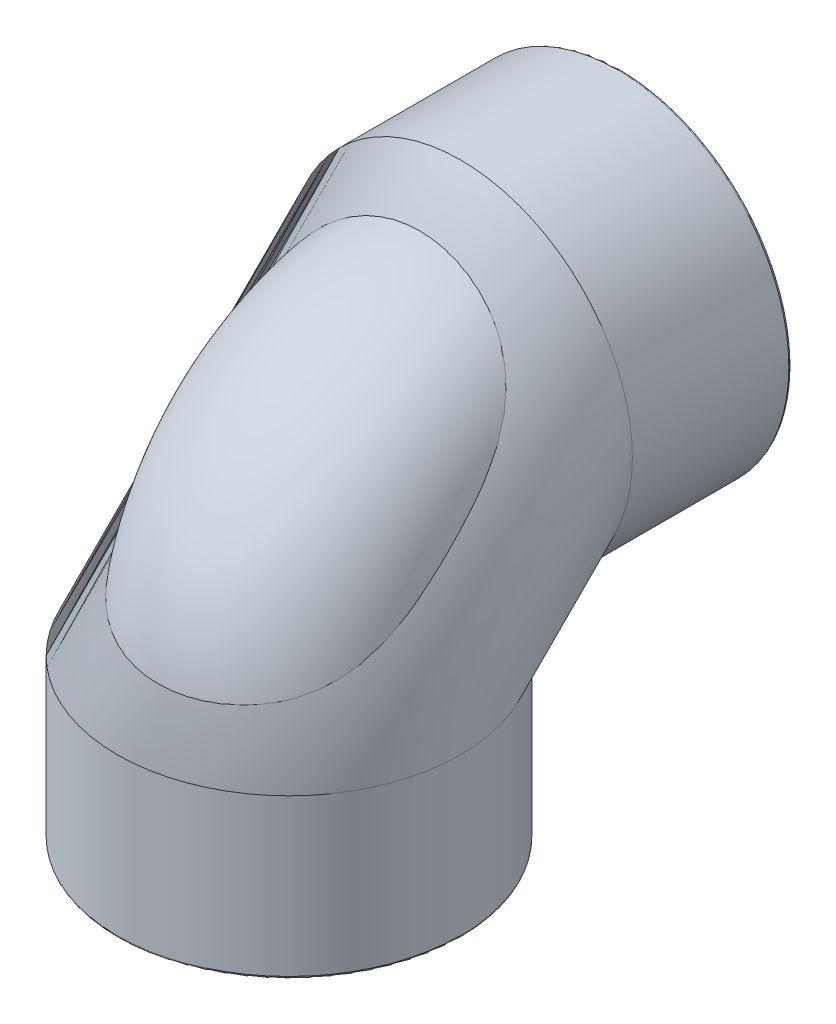
ISO-10303-21;
HEADER;
FILE_DESCRIPTION(('STEP AP214'),'2;1');
FILE_NAME('part.step','',(''),(''),'','','');
FILE_SCHEMA(('AUTOMOTIVE_DESIGN { 1 0 10303 214 1 1 1 1 }'));
ENDSEC;
DATA;
#1=APPLICATION_CONTEXT('core data for automotive mechanical design processes');
#2=APPLICATION_PROTOCOL_DEFINITION('international standard','automotive_design',2000,#1);
#3=PRODUCT_CONTEXT('',#1,'mechanical');
#4=PRODUCT('Part','Part','',(#3));
#5=PRODUCT_RELATED_PRODUCT_CATEGORY('part','',(#4));
#6=PRODUCT_DEFINITION_FORMATION('','',#4);
#7=PRODUCT_DEFINITION_CONTEXT('part definition',#1,'design');
#8=PRODUCT_DEFINITION('design','',#6,#7);
#9=PRODUCT_DEFINITION_SHAPE('','',#8);
#10=(LENGTH_UNIT() NAMED_UNIT(*) SI_UNIT(.MILLI.,.METRE.));
#11=(NAMED_UNIT(*) PLANE_ANGLE_UNIT() SI_UNIT($,.RADIAN.));
#12=(NAMED_UNIT(*) SI_UNIT($,.STERADIAN.) SOLID_ANGLE_UNIT());
#13=UNCERTAINTY_MEASURE_WITH_UNIT(LENGTH_MEASURE(1.E-05),#10,'distance_accuracy_value','');
#14=(GEOMETRIC_REPRESENTATION_CONTEXT(3) GLOBAL_UNCERTAINTY_ASSIGNED_CONTEXT((#13)) GLOBAL_UNIT_ASSIGNED_CONTEXT((#10,
#11,#12)) REPRESENTATION_CONTEXT('',''));
#15=CARTESIAN_POINT('',(0.,0.,0.));
#16=DIRECTION('',(0.,0.,1.));
#17=DIRECTION('',(1.,0.,0.));
#18=AXIS2_PLACEMENT_3D('',#15,#16,#17);
#19=CARTESIAN_POINT('',(0.,0.,0.));
#20=DIRECTION('',(0.,1.,0.));
#21=DIRECTION('',(0.,0.,1.));
#22=AXIS2_PLACEMENT_3D('',#19,#20,#21);
#23=CYLINDRICAL_SURFACE('',#22,17.145);
#24=CARTESIAN_POINT('',(0.,0.254,0.));
#25=DIRECTION('',(0.,1.,0.));
#26=DIRECTION('',(0.,0.,1.));
#27=AXIS2_PLACEMENT_3D('',#24,#25,#26);
#28=CIRCLE('',#27,17.145);
#29=CARTESIAN_POINT('',(0.,0.254,17.145));
#30=VERTEX_POINT('',#29);
#31=EDGE_CURVE('E69',#30,#30,#28,.T.);
#32=ORIENTED_EDGE('',*,*,#31,.T.);
#33=EDGE_LOOP('',(#32));
#34=FACE_BOUND('',#33,.T.);
#35=CARTESIAN_POINT('',(0.,15.875,0.));
#36=DIRECTION('',(0.,1.,0.));
#37=DIRECTION('',(0.,0.,1.));
#38=AXIS2_PLACEMENT_3D('',#35,#36,#37);
#39=CIRCLE('',#38,17.145);
#40=CARTESIAN_POINT('',(0.,15.875,-17.145));
#41=VERTEX_POINT('',#40);
#42=EDGE_CURVE('E48',#41,#41,#39,.T.);
#43=ORIENTED_EDGE('',*,*,#42,.F.);
#44=EDGE_LOOP('',(#43));
#45=FACE_BOUND('',#44,.T.);
#46=ADVANCED_FACE('F37',(#34,#45),#23,.T.);
#47=CARTESIAN_POINT('',(0.,15.875,-17.145));
#48=DIRECTION('',(-1.,0.,0.));
#49=DIRECTION('',(0.,0.,1.));
#50=AXIS2_PLACEMENT_3D('',#47,#48,#49);
#51=DEGENERATE_TOROIDAL_SURFACE('',#50,17.145,17.145,.T.);
#52=CARTESIAN_POINT('',(0.,33.02,-17.145));
#53=DIRECTION('',(0.,0.,-1.));
#54=DIRECTION('',(0.,1.,0.));
#55=AXIS2_PLACEMENT_3D('',#52,#53,#54);
#56=CIRCLE('',#55,17.145);
#57=EDGE_CURVE('E52',#41,#41,#56,.T.);
#58=ORIENTED_EDGE('',*,*,#57,.F.);
#59=ORIENTED_EDGE('',*,*,#42,.T.);
#60=EDGE_LOOP('',(#58,#59));
#61=FACE_BOUND('',#60,.T.);
#62=ADVANCED_FACE('F122',(#61),#51,.T.);
#63=CARTESIAN_POINT('',(0.,33.02,-17.145));
#64=DIRECTION('',(0.,0.,-1.));
#65=DIRECTION('',(-1.,0.,0.));
#66=AXIS2_PLACEMENT_3D('',#63,#64,#65);
#67=CYLINDRICAL_SURFACE('',#66,17.145);
#68=CARTESIAN_POINT('',(0.,33.02,-32.766));
#69=DIRECTION('',(0.,0.,-1.));
#70=DIRECTION('',(-1.,0.,0.));
#71=AXIS2_PLACEMENT_3D('',#68,#69,#70);
#72=CIRCLE('',#71,17.145);
#73=CARTESIAN_POINT('',(-17.145,33.02,-32.766));
#74=VERTEX_POINT('',#73);
#75=EDGE_CURVE('E11',#74,#74,#72,.F.);
#76=ORIENTED_EDGE('',*,*,#75,.T.);
#77=EDGE_LOOP('',(#76));
#78=FACE_BOUND('',#77,.T.);
#79=ORIENTED_EDGE('',*,*,#57,.T.);
#80=EDGE_LOOP('',(#79));
#81=FACE_BOUND('',#80,.T.);
#82=ADVANCED_FACE('F118',(#78,#81),#67,.T.);
#83=CARTESIAN_POINT('',(0.,0.,0.));
#84=DIRECTION('',(0.,1.,0.));
#85=DIRECTION('',(0.,0.,1.));
#86=AXIS2_PLACEMENT_3D('',#83,#84,#85);
#87=PLANE('',#86);
#88=CARTESIAN_POINT('',(0.,0.,0.));
#89=DIRECTION('',(0.,1.,0.));
#90=DIRECTION('',(0.,0.,1.));
#91=AXIS2_PLACEMENT_3D('',#88,#89,#90);
#92=CIRCLE('',#91,13.589);
#93=CARTESIAN_POINT('',(0.,0.,13.589));
#94=VERTEX_POINT('',#93);
#95=EDGE_CURVE('E66',#94,#94,#92,.T.);
#96=ORIENTED_EDGE('',*,*,#95,.T.);
#97=EDGE_LOOP('',(#96));
#98=FACE_BOUND('',#97,.T.);
#99=CARTESIAN_POINT('',(0.,0.,0.));
#100=DIRECTION('',(0.,1.,0.));
#101=DIRECTION('',(0.,0.,1.));
#102=AXIS2_PLACEMENT_3D('',#99,#100,#101);
#103=CIRCLE('',#102,16.891);
#104=CARTESIAN_POINT('',(0.,0.,16.891));
#105=VERTEX_POINT('',#104);
#106=EDGE_CURVE('E63',#105,#105,#103,.F.);
#107=ORIENTED_EDGE('',*,*,#106,.T.);
#108=EDGE_LOOP('',(#107));
#109=FACE_BOUND('',#108,.T.);
#110=ADVANCED_FACE('F93',(#98,#109),#87,.F.);
#111=CARTESIAN_POINT('',(0.,33.02,-33.02));
#112=DIRECTION('',(0.,0.,-1.));
#113=DIRECTION('',(0.,1.,0.));
#114=AXIS2_PLACEMENT_3D('',#111,#112,#113);
#115=PLANE('',#114);
#116=CARTESIAN_POINT('',(0.,33.02,-33.02));
#117=DIRECTION('',(0.,0.,-1.));
#118=DIRECTION('',(-1.,0.,0.));
#119=AXIS2_PLACEMENT_3D('',#116,#117,#118);
#120=CIRCLE('',#119,13.589);
#121=CARTESIAN_POINT('',(-13.589,33.02,-33.02));
#122=VERTEX_POINT('',#121);
#123=EDGE_CURVE('E75',#122,#122,#120,.F.);
#124=ORIENTED_EDGE('',*,*,#123,.T.);
#125=EDGE_LOOP('',(#124));
#126=FACE_BOUND('',#125,.T.);
#127=CARTESIAN_POINT('',(0.,33.02,-33.02));
#128=DIRECTION('',(0.,0.,-1.));
#129=DIRECTION('',(-1.,0.,0.));
#130=AXIS2_PLACEMENT_3D('',#127,#128,#129);
#131=CIRCLE('',#130,16.891);
#132=CARTESIAN_POINT('',(-16.891,33.02,-33.02));
#133=VERTEX_POINT('',#132);
#134=EDGE_CURVE('E72',#133,#133,#131,.T.);
#135=ORIENTED_EDGE('',*,*,#134,.T.);
#136=EDGE_LOOP('',(#135));
#137=FACE_BOUND('',#136,.T.);
#138=ADVANCED_FACE('F89',(#126,#137),#115,.T.);
#139=CARTESIAN_POINT('',(0.,0.,0.));
#140=DIRECTION('',(0.,1.,0.));
#141=DIRECTION('',(0.,0.,1.));
#142=AXIS2_PLACEMENT_3D('',#139,#140,#141);
#143=CYLINDRICAL_SURFACE('',#142,13.335);
#144=CARTESIAN_POINT('',(0.,0.254,0.));
#145=DIRECTION('',(0.,1.,0.));
#146=DIRECTION('',(0.,0.,1.));
#147=AXIS2_PLACEMENT_3D('',#144,#145,#146);
#148=CIRCLE('',#147,13.335);
#149=CARTESIAN_POINT('',(0.,0.254,13.335));
#150=VERTEX_POINT('',#149);
#151=EDGE_CURVE('E60',#150,#150,#148,.F.);
#152=ORIENTED_EDGE('',*,*,#151,.T.);
#153=EDGE_LOOP('',(#152));
#154=FACE_BOUND('',#153,.T.);
#155=CARTESIAN_POINT('',(0.,15.875,0.));
#156=DIRECTION('',(0.,1.,0.));
#157=DIRECTION('',(0.,0.,1.));
#158=AXIS2_PLACEMENT_3D('',#155,#156,#157);
#159=CIRCLE('',#158,13.335);
#160=CARTESIAN_POINT('',(0.,15.875,13.335));
#161=VERTEX_POINT('',#160);
#162=EDGE_CURVE('E54',#161,#161,#159,.F.);
#163=ORIENTED_EDGE('',*,*,#162,.F.);
#164=EDGE_LOOP('',(#163));
#165=FACE_BOUND('',#164,.T.);
#166=ADVANCED_FACE('F92',(#154,#165),#143,.F.);
#167=CARTESIAN_POINT('',(0.,15.875,-17.145));
#168=DIRECTION('',(-1.,0.,0.));
#169=DIRECTION('',(0.,0.,1.));
#170=AXIS2_PLACEMENT_3D('',#167,#168,#169);
#171=TOROIDAL_SURFACE('',#170,17.145,13.335);
#172=CARTESIAN_POINT('',(0.,33.02,-17.145));
#173=DIRECTION('',(0.,0.,-1.));
#174=DIRECTION('',(0.,1.,0.));
#175=AXIS2_PLACEMENT_3D('',#172,#173,#174);
#176=CIRCLE('',#175,13.335);
#177=CARTESIAN_POINT('',(0.,46.355,-17.145));
#178=VERTEX_POINT('',#177);
#179=EDGE_CURVE('E57',#178,#178,#176,.F.);
#180=CARTESIAN_POINT('',(0.,15.875,-17.145));
#181=DIRECTION('',(-1.,0.,0.));
#182=DIRECTION('',(0.,0.,1.));
#183=AXIS2_PLACEMENT_3D('',#180,#181,#182);
#184=CIRCLE('',#183,30.48);
#185=EDGE_CURVE('',#161,#178,#184,.T.);
#186=ORIENTED_EDGE('',*,*,#162,.T.);
#187=ORIENTED_EDGE('',*,*,#179,.F.);
#188=ORIENTED_EDGE('',*,*,#185,.T.);
#189=ORIENTED_EDGE('',*,*,#185,.F.);
#190=EDGE_LOOP('',(#186,#188,#187,#189));
#191=FACE_BOUND('',#190,.T.);
#192=ADVANCED_FACE('F104',(#191),#171,.F.);
#193=CARTESIAN_POINT('',(0.,33.02,-17.145));
#194=DIRECTION('',(0.,0.,-1.));
#195=DIRECTION('',(-1.,0.,0.));
#196=AXIS2_PLACEMENT_3D('',#193,#194,#195);
#197=CYLINDRICAL_SURFACE('',#196,13.335);
#198=CARTESIAN_POINT('',(0.,33.02,-32.766));
#199=DIRECTION('',(0.,0.,-1.));
#200=DIRECTION('',(-1.,0.,0.));
#201=AXIS2_PLACEMENT_3D('',#198,#199,#200);
#202=CIRCLE('',#201,13.335);
#203=CARTESIAN_POINT('',(-13.335,33.02,-32.766));
#204=VERTEX_POINT('',#203);
#205=EDGE_CURVE('E44',#204,#204,#202,.T.);
#206=ORIENTED_EDGE('',*,*,#205,.T.);
#207=EDGE_LOOP('',(#206));
#208=FACE_BOUND('',#207,.T.);
#209=ORIENTED_EDGE('',*,*,#179,.T.);
#210=EDGE_LOOP('',(#209));
#211=FACE_BOUND('',#210,.T.);
#212=ADVANCED_FACE('F80',(#208,#211),#197,.F.);
#213=CARTESIAN_POINT('',(0.,0.254,0.));
#214=DIRECTION('',(0.,1.,0.));
#215=DIRECTION('',(0.,0.,1.));
#216=AXIS2_PLACEMENT_3D('',#213,#214,#215);
#217=TOROIDAL_SURFACE('',#216,13.589,0.254);
#218=ORIENTED_EDGE('',*,*,#95,.F.);
#219=EDGE_LOOP('',(#218));
#220=FACE_BOUND('',#219,.T.);
#221=ORIENTED_EDGE('',*,*,#151,.F.);
#222=EDGE_LOOP('',(#221));
#223=FACE_BOUND('',#222,.T.);
#224=ADVANCED_FACE('F103',(#220,#223),#217,.T.);
#225=CARTESIAN_POINT('',(0.,0.254,0.));
#226=DIRECTION('',(0.,1.,0.));
#227=DIRECTION('',(0.,0.,1.));
#228=AXIS2_PLACEMENT_3D('',#225,#226,#227);
#229=TOROIDAL_SURFACE('',#228,16.891,0.254);
#230=ORIENTED_EDGE('',*,*,#106,.F.);
#231=EDGE_LOOP('',(#230));
#232=FACE_BOUND('',#231,.T.);
#233=ORIENTED_EDGE('',*,*,#31,.F.);
#234=EDGE_LOOP('',(#233));
#235=FACE_BOUND('',#234,.T.);
#236=ADVANCED_FACE('F86',(#232,#235),#229,.T.);
#237=CARTESIAN_POINT('',(0.,33.02,-32.766));
#238=DIRECTION('',(0.,0.,-1.));
#239=DIRECTION('',(-1.,0.,0.));
#240=AXIS2_PLACEMENT_3D('',#237,#238,#239);
#241=TOROIDAL_SURFACE('',#240,13.589,0.254);
#242=ORIENTED_EDGE('',*,*,#205,.F.);
#243=EDGE_LOOP('',(#242));
#244=FACE_BOUND('',#243,.T.);
#245=ORIENTED_EDGE('',*,*,#123,.F.);
#246=EDGE_LOOP('',(#245));
#247=FACE_BOUND('',#246,.T.);
#248=ADVANCED_FACE('F83',(#244,#247),#241,.T.);
#249=CARTESIAN_POINT('',(0.,33.02,-32.766));
#250=DIRECTION('',(0.,0.,-1.));
#251=DIRECTION('',(-1.,0.,0.));
#252=AXIS2_PLACEMENT_3D('',#249,#250,#251);
#253=TOROIDAL_SURFACE('',#252,16.891,0.254);
#254=ORIENTED_EDGE('',*,*,#75,.F.);
#255=EDGE_LOOP('',(#254));
#256=FACE_BOUND('',#255,.T.);
#257=ORIENTED_EDGE('',*,*,#134,.F.);
#258=EDGE_LOOP('',(#257));
#259=FACE_BOUND('',#258,.T.);
#260=ADVANCED_FACE('F39',(#256,#259),#253,.T.);
#261=CLOSED_SHELL('',(#46,#62,#82,#110,#138,#166,#192,#212,#224,#236,#248,#260));
#262=MANIFOLD_SOLID_BREP('B2',#261);
#263=ADVANCED_BREP_SHAPE_REPRESENTATION('',(#18,#262),#14);
#264=SHAPE_DEFINITION_REPRESENTATION(#9,#263);
ENDSEC;
END-ISO-10303-21;
